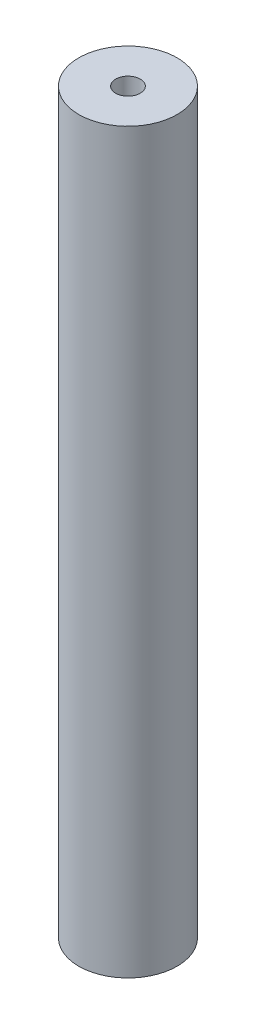
ISO-10303-21;
HEADER;
FILE_DESCRIPTION(('STEP AP214'),'2;1');
FILE_NAME('part.step','',(''),(''),'','','');
FILE_SCHEMA(('AUTOMOTIVE_DESIGN { 1 0 10303 214 1 1 1 1 }'));
ENDSEC;
DATA;
#1=APPLICATION_CONTEXT('core data for automotive mechanical design processes');
#2=APPLICATION_PROTOCOL_DEFINITION('international standard','automotive_design',2000,#1);
#3=PRODUCT_CONTEXT('',#1,'mechanical');
#4=PRODUCT('Part','Part','',(#3));
#5=PRODUCT_RELATED_PRODUCT_CATEGORY('part','',(#4));
#6=PRODUCT_DEFINITION_FORMATION('','',#4);
#7=PRODUCT_DEFINITION_CONTEXT('part definition',#1,'design');
#8=PRODUCT_DEFINITION('design','',#6,#7);
#9=PRODUCT_DEFINITION_SHAPE('','',#8);
#10=(LENGTH_UNIT() NAMED_UNIT(*) SI_UNIT(.MILLI.,.METRE.));
#11=(NAMED_UNIT(*) PLANE_ANGLE_UNIT() SI_UNIT($,.RADIAN.));
#12=(NAMED_UNIT(*) SI_UNIT($,.STERADIAN.) SOLID_ANGLE_UNIT());
#13=UNCERTAINTY_MEASURE_WITH_UNIT(LENGTH_MEASURE(1.E-05),#10,'distance_accuracy_value','');
#14=(GEOMETRIC_REPRESENTATION_CONTEXT(3) GLOBAL_UNCERTAINTY_ASSIGNED_CONTEXT((#13)) GLOBAL_UNIT_ASSIGNED_CONTEXT((#10,
#11,#12)) REPRESENTATION_CONTEXT('',''));
#15=CARTESIAN_POINT('',(0.,0.,0.));
#16=DIRECTION('',(0.,0.,1.));
#17=DIRECTION('',(1.,0.,0.));
#18=AXIS2_PLACEMENT_3D('',#15,#16,#17);
#19=CARTESIAN_POINT('',(0.,-180.,0.));
#20=DIRECTION('',(0.,1.,0.));
#21=DIRECTION('',(0.,0.,1.));
#22=AXIS2_PLACEMENT_3D('',#19,#20,#21);
#23=CYLINDRICAL_SURFACE('',#22,12.);
#24=CARTESIAN_POINT('',(0.,-180.,0.));
#25=DIRECTION('',(0.,1.,0.));
#26=DIRECTION('',(0.,0.,1.));
#27=AXIS2_PLACEMENT_3D('',#24,#25,#26);
#28=CIRCLE('',#27,12.);
#29=CARTESIAN_POINT('',(0.,-180.,12.));
#30=VERTEX_POINT('',#29);
#31=EDGE_CURVE('E11',#30,#30,#28,.T.);
#32=CARTESIAN_POINT('',(0.,0.,0.));
#33=DIRECTION('',(0.,1.,0.));
#34=DIRECTION('',(0.,0.,1.));
#35=AXIS2_PLACEMENT_3D('',#32,#33,#34);
#36=CIRCLE('',#35,12.);
#37=CARTESIAN_POINT('',(0.,0.,12.));
#38=VERTEX_POINT('',#37);
#39=EDGE_CURVE('E46',#38,#38,#36,.T.);
#40=CARTESIAN_POINT('',(0.,-180.,12.));
#41=CARTESIAN_POINT('',(0.,-178.125,12.));
#42=CARTESIAN_POINT('',(0.,-176.25,12.));
#43=CARTESIAN_POINT('',(0.,-172.5,12.));
#44=CARTESIAN_POINT('',(0.,-170.625,12.));
#45=CARTESIAN_POINT('',(0.,-166.875,12.));
#46=CARTESIAN_POINT('',(0.,-165.,12.));
#47=CARTESIAN_POINT('',(0.,-161.25,12.));
#48=CARTESIAN_POINT('',(0.,-159.375,12.));
#49=CARTESIAN_POINT('',(0.,-155.625,12.));
#50=CARTESIAN_POINT('',(0.,-153.75,12.));
#51=CARTESIAN_POINT('',(0.,-150.,12.));
#52=CARTESIAN_POINT('',(0.,-148.125,12.));
#53=CARTESIAN_POINT('',(0.,-144.375,12.));
#54=CARTESIAN_POINT('',(0.,-142.5,12.));
#55=CARTESIAN_POINT('',(0.,-138.75,12.));
#56=CARTESIAN_POINT('',(0.,-136.875,12.));
#57=CARTESIAN_POINT('',(0.,-133.125,12.));
#58=CARTESIAN_POINT('',(0.,-131.25,12.));
#59=CARTESIAN_POINT('',(0.,-127.5,12.));
#60=CARTESIAN_POINT('',(0.,-125.625,12.));
#61=CARTESIAN_POINT('',(0.,-121.875,12.));
#62=CARTESIAN_POINT('',(0.,-120.,12.));
#63=CARTESIAN_POINT('',(0.,-116.25,12.));
#64=CARTESIAN_POINT('',(0.,-114.375,12.));
#65=CARTESIAN_POINT('',(0.,-110.625,12.));
#66=CARTESIAN_POINT('',(0.,-108.75,12.));
#67=CARTESIAN_POINT('',(0.,-105.,12.));
#68=CARTESIAN_POINT('',(0.,-103.125,12.));
#69=CARTESIAN_POINT('',(0.,-99.375,12.));
#70=CARTESIAN_POINT('',(0.,-97.5,12.));
#71=CARTESIAN_POINT('',(0.,-93.75,12.));
#72=CARTESIAN_POINT('',(0.,-91.875,12.));
#73=CARTESIAN_POINT('',(0.,-88.125,12.));
#74=CARTESIAN_POINT('',(0.,-86.25,12.));
#75=CARTESIAN_POINT('',(0.,-82.5,12.));
#76=CARTESIAN_POINT('',(0.,-80.625,12.));
#77=CARTESIAN_POINT('',(0.,-76.875,12.));
#78=CARTESIAN_POINT('',(0.,-75.,12.));
#79=CARTESIAN_POINT('',(0.,-71.25,12.));
#80=CARTESIAN_POINT('',(0.,-69.375,12.));
#81=CARTESIAN_POINT('',(0.,-65.625,12.));
#82=CARTESIAN_POINT('',(0.,-63.75,12.));
#83=CARTESIAN_POINT('',(0.,-60.,12.));
#84=CARTESIAN_POINT('',(0.,-58.125,12.));
#85=CARTESIAN_POINT('',(0.,-54.375,12.));
#86=CARTESIAN_POINT('',(0.,-52.5,12.));
#87=CARTESIAN_POINT('',(0.,-48.75,12.));
#88=CARTESIAN_POINT('',(0.,-46.875,12.));
#89=CARTESIAN_POINT('',(0.,-43.125,12.));
#90=CARTESIAN_POINT('',(0.,-41.25,12.));
#91=CARTESIAN_POINT('',(0.,-37.5,12.));
#92=CARTESIAN_POINT('',(0.,-35.625,12.));
#93=CARTESIAN_POINT('',(0.,-31.875,12.));
#94=CARTESIAN_POINT('',(0.,-30.,12.));
#95=CARTESIAN_POINT('',(0.,-26.25,12.));
#96=CARTESIAN_POINT('',(0.,-24.375,12.));
#97=CARTESIAN_POINT('',(0.,-20.625,12.));
#98=CARTESIAN_POINT('',(0.,-18.75,12.));
#99=CARTESIAN_POINT('',(0.,-15.,12.));
#100=CARTESIAN_POINT('',(0.,-13.125,12.));
#101=CARTESIAN_POINT('',(0.,-9.375,12.));
#102=CARTESIAN_POINT('',(0.,-7.5,12.));
#103=CARTESIAN_POINT('',(0.,-3.74999999999999,12.));
#104=CARTESIAN_POINT('',(0.,-1.875,12.));
#105=CARTESIAN_POINT('',(0.,0.,12.));
#106=B_SPLINE_CURVE_WITH_KNOTS('',3,(#40,#41,#42,#43,#44,#45,#46,#47,#48,#49,#50,#51,#52,#53,
#54,#55,#56,#57,#58,#59,#60,#61,#62,#63,#64,#65,#66,#67,#68,#69,#70,#71,#72,#73,#74,#75,#76,#77,
#78,#79,#80,#81,#82,#83,#84,#85,#86,#87,#88,#89,#90,#91,#92,#93,#94,#95,#96,#97,#98,#99,#100,
#101,#102,#103,#104,#105),.UNSPECIFIED.,.F.,.F.,(4,2,2,2,2,2,2,2,2,2,2,2,2,2,2,2,2,2,2,2,2,2,2,
2,2,2,2,2,2,2,2,2,4),(0.,5.62500000000002,11.25,16.875,22.5,28.125,33.75,39.375,45.,50.625,
56.25,61.875,67.5,73.125,78.75,84.375,90.,95.625,101.25,106.875,112.5,118.125,123.75,129.375,
135.,140.625,146.25,151.875,157.5,163.125,168.75,174.375,180.),.UNSPECIFIED.);
#107=EDGE_CURVE('BSEAM43',#30,#38,#106,.T.);
#108=ORIENTED_EDGE('',*,*,#31,.T.);
#109=ORIENTED_EDGE('',*,*,#39,.F.);
#110=ORIENTED_EDGE('',*,*,#107,.T.);
#111=ORIENTED_EDGE('',*,*,#107,.F.);
#112=EDGE_LOOP('',(#108,#110,#109,#111));
#113=FACE_BOUND('',#112,.T.);
#114=ADVANCED_FACE('F43',(#113),#23,.T.);
#115=CARTESIAN_POINT('',(0.,-180.,0.));
#116=DIRECTION('',(0.,1.,0.));
#117=DIRECTION('',(0.,0.,1.));
#118=AXIS2_PLACEMENT_3D('',#115,#116,#117);
#119=PLANE('',#118);
#120=ORIENTED_EDGE('',*,*,#31,.F.);
#121=EDGE_LOOP('',(#120));
#122=FACE_BOUND('',#121,.T.);
#123=ADVANCED_FACE('F87',(#122),#119,.F.);
#124=CARTESIAN_POINT('',(0.,0.,0.));
#125=DIRECTION('',(0.,1.,0.));
#126=DIRECTION('',(0.,0.,1.));
#127=AXIS2_PLACEMENT_3D('',#124,#125,#126);
#128=PLANE('',#127);
#129=CARTESIAN_POINT('',(0.,0.,0.));
#130=DIRECTION('',(0.,1.,0.));
#131=DIRECTION('',(0.,0.,1.));
#132=AXIS2_PLACEMENT_3D('',#129,#130,#131);
#133=CIRCLE('',#132,3.);
#134=CARTESIAN_POINT('',(0.,0.,3.));
#135=VERTEX_POINT('',#134);
#136=EDGE_CURVE('E69',#135,#135,#133,.T.);
#137=ORIENTED_EDGE('',*,*,#136,.F.);
#138=EDGE_LOOP('',(#137));
#139=FACE_BOUND('',#138,.T.);
#140=ORIENTED_EDGE('',*,*,#39,.T.);
#141=EDGE_LOOP('',(#140));
#142=FACE_BOUND('',#141,.T.);
#143=ADVANCED_FACE('F84',(#139,#142),#128,.T.);
#144=CARTESIAN_POINT('',(0.,0.,0.));
#145=DIRECTION('',(0.,1.,0.));
#146=DIRECTION('',(0.,0.,1.));
#147=AXIS2_PLACEMENT_3D('',#144,#145,#146);
#148=CYLINDRICAL_SURFACE('',#147,3.);
#149=CARTESIAN_POINT('',(0.,-12.,0.));
#150=DIRECTION('',(0.,1.,0.));
#151=DIRECTION('',(0.,0.,1.));
#152=AXIS2_PLACEMENT_3D('',#149,#150,#151);
#153=CIRCLE('',#152,3.);
#154=CARTESIAN_POINT('',(0.,-12.,3.));
#155=VERTEX_POINT('',#154);
#156=EDGE_CURVE('E64',#155,#155,#153,.T.);
#157=ORIENTED_EDGE('',*,*,#156,.F.);
#158=EDGE_LOOP('',(#157));
#159=FACE_BOUND('',#158,.T.);
#160=ORIENTED_EDGE('',*,*,#136,.T.);
#161=EDGE_LOOP('',(#160));
#162=FACE_BOUND('',#161,.T.);
#163=ADVANCED_FACE('F98',(#159,#162),#148,.F.);
#164=CARTESIAN_POINT('',(2.5,-12.,0.));
#165=DIRECTION('',(0.,-1.,0.));
#166=DIRECTION('',(0.,0.,-1.));
#167=AXIS2_PLACEMENT_3D('',#164,#165,#166);
#168=PLANE('',#167);
#169=CARTESIAN_POINT('',(0.,-12.,0.));
#170=DIRECTION('',(0.,1.,0.));
#171=DIRECTION('',(0.,0.,1.));
#172=AXIS2_PLACEMENT_3D('',#169,#170,#171);
#173=CIRCLE('',#172,2.5);
#174=CARTESIAN_POINT('',(0.,-12.,2.5));
#175=VERTEX_POINT('',#174);
#176=EDGE_CURVE('E61',#175,#175,#173,.T.);
#177=ORIENTED_EDGE('',*,*,#176,.F.);
#178=EDGE_LOOP('',(#177));
#179=FACE_BOUND('',#178,.T.);
#180=ORIENTED_EDGE('',*,*,#156,.T.);
#181=EDGE_LOOP('',(#180));
#182=FACE_BOUND('',#181,.T.);
#183=ADVANCED_FACE('F103',(#179,#182),#168,.F.);
#184=CARTESIAN_POINT('',(0.,0.,0.));
#185=DIRECTION('',(0.,1.,0.));
#186=DIRECTION('',(0.,0.,1.));
#187=AXIS2_PLACEMENT_3D('',#184,#185,#186);
#188=CYLINDRICAL_SURFACE('',#187,2.5);
#189=CARTESIAN_POINT('',(0.,-15.,0.));
#190=DIRECTION('',(0.,1.,0.));
#191=DIRECTION('',(0.,0.,1.));
#192=AXIS2_PLACEMENT_3D('',#189,#190,#191);
#193=CIRCLE('',#192,2.5);
#194=CARTESIAN_POINT('',(0.,-15.,2.5));
#195=VERTEX_POINT('',#194);
#196=EDGE_CURVE('E59',#195,#195,#193,.T.);
#197=ORIENTED_EDGE('',*,*,#196,.F.);
#198=EDGE_LOOP('',(#197));
#199=FACE_BOUND('',#198,.T.);
#200=ORIENTED_EDGE('',*,*,#176,.T.);
#201=EDGE_LOOP('',(#200));
#202=FACE_BOUND('',#201,.T.);
#203=ADVANCED_FACE('F55',(#199,#202),#188,.F.);
#204=CARTESIAN_POINT('',(0.,-15.,0.));
#205=DIRECTION('',(0.,1.,0.));
#206=DIRECTION('',(0.,0.,1.));
#207=AXIS2_PLACEMENT_3D('',#204,#205,#206);
#208=CONICAL_SURFACE('',#207,2.5,1.02974425867665);
#209=CARTESIAN_POINT('',(0.,-16.5021515475689,0.));
#210=VERTEX_POINT('',#209);
#211=VERTEX_LOOP('',#210);
#212=FACE_BOUND('',#211,.T.);
#213=ORIENTED_EDGE('',*,*,#196,.T.);
#214=EDGE_LOOP('',(#213));
#215=FACE_BOUND('',#214,.T.);
#216=ADVANCED_FACE('F52',(#212,#215),#208,.F.);
#217=CLOSED_SHELL('',(#114,#123,#143,#163,#183,#203,#216));
#218=MANIFOLD_SOLID_BREP('B2',#217);
#219=ADVANCED_BREP_SHAPE_REPRESENTATION('',(#18,#218),#14);
#220=SHAPE_DEFINITION_REPRESENTATION(#9,#219);
ENDSEC;
END-ISO-10303-21;
